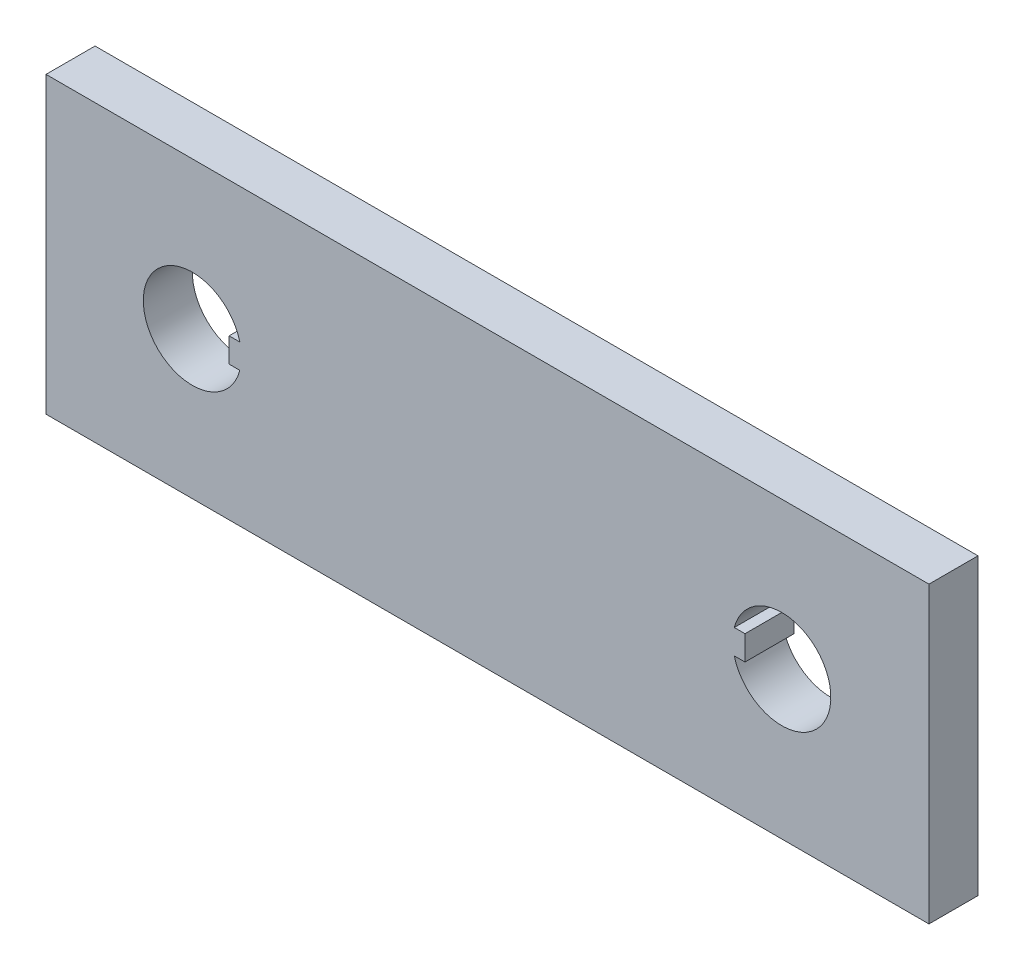
ISO-10303-21;
HEADER;
FILE_DESCRIPTION(('STEP AP214'),'2;1');
FILE_NAME('part.step','',(''),(''),'','','');
FILE_SCHEMA(('AUTOMOTIVE_DESIGN { 1 0 10303 214 1 1 1 1 }'));
ENDSEC;
DATA;
#1=APPLICATION_CONTEXT('core data for automotive mechanical design processes');
#2=APPLICATION_PROTOCOL_DEFINITION('international standard','automotive_design',2000,#1);
#3=PRODUCT_CONTEXT('',#1,'mechanical');
#4=PRODUCT('Part','Part','',(#3));
#5=PRODUCT_RELATED_PRODUCT_CATEGORY('part','',(#4));
#6=PRODUCT_DEFINITION_FORMATION('','',#4);
#7=PRODUCT_DEFINITION_CONTEXT('part definition',#1,'design');
#8=PRODUCT_DEFINITION('design','',#6,#7);
#9=PRODUCT_DEFINITION_SHAPE('','',#8);
#10=(LENGTH_UNIT() NAMED_UNIT(*) SI_UNIT(.MILLI.,.METRE.));
#11=(NAMED_UNIT(*) PLANE_ANGLE_UNIT() SI_UNIT($,.RADIAN.));
#12=(NAMED_UNIT(*) SI_UNIT($,.STERADIAN.) SOLID_ANGLE_UNIT());
#13=UNCERTAINTY_MEASURE_WITH_UNIT(LENGTH_MEASURE(1.E-05),#10,'distance_accuracy_value','');
#14=(GEOMETRIC_REPRESENTATION_CONTEXT(3) GLOBAL_UNCERTAINTY_ASSIGNED_CONTEXT((#13)) GLOBAL_UNIT_ASSIGNED_CONTEXT((#10,
#11,#12)) REPRESENTATION_CONTEXT('',''));
#15=CARTESIAN_POINT('',(0.,0.,0.));
#16=DIRECTION('',(0.,0.,1.));
#17=DIRECTION('',(1.,0.,0.));
#18=AXIS2_PLACEMENT_3D('',#15,#16,#17);
#19=CARTESIAN_POINT('',(57.15,-19.05,6.35));
#20=DIRECTION('',(-1.,0.,0.));
#21=DIRECTION('',(0.,0.,1.));
#22=AXIS2_PLACEMENT_3D('',#19,#20,#21);
#23=PLANE('',#22);
#24=DIRECTION('',(0.,1.,0.));
#25=VECTOR('',#24,1.);
#26=CARTESIAN_POINT('',(57.15,-19.05,0.));
#27=LINE('',#26,#25);
#28=CARTESIAN_POINT('',(57.15,-19.05,0.));
#29=VERTEX_POINT('',#28);
#30=CARTESIAN_POINT('',(57.15,19.05,0.));
#31=VERTEX_POINT('',#30);
#32=EDGE_CURVE('E183',#29,#31,#27,.T.);
#33=ORIENTED_EDGE('',*,*,#32,.T.);
#34=DIRECTION('',(0.,0.,-1.));
#35=VECTOR('',#34,1.);
#36=CARTESIAN_POINT('',(57.15,19.05,6.35));
#37=LINE('',#36,#35);
#38=CARTESIAN_POINT('',(57.15,19.05,6.35));
#39=VERTEX_POINT('',#38);
#40=EDGE_CURVE('E11',#39,#31,#37,.T.);
#41=ORIENTED_EDGE('',*,*,#40,.F.);
#42=DIRECTION('',(0.,1.,0.));
#43=VECTOR('',#42,1.);
#44=CARTESIAN_POINT('',(57.15,-19.05,6.35));
#45=LINE('',#44,#43);
#46=CARTESIAN_POINT('',(57.15,-19.05,6.35));
#47=VERTEX_POINT('',#46);
#48=EDGE_CURVE('E190',#47,#39,#45,.T.);
#49=ORIENTED_EDGE('',*,*,#48,.F.);
#50=DIRECTION('',(0.,0.,-1.));
#51=VECTOR('',#50,1.);
#52=CARTESIAN_POINT('',(57.15,-19.05,6.35));
#53=LINE('',#52,#51);
#54=EDGE_CURVE('E200',#47,#29,#53,.T.);
#55=ORIENTED_EDGE('',*,*,#54,.T.);
#56=EDGE_LOOP('',(#33,#41,#49,#55));
#57=FACE_BOUND('',#56,.T.);
#58=ADVANCED_FACE('F33',(#57),#23,.F.);
#59=CARTESIAN_POINT('',(-57.15,19.05,6.35));
#60=DIRECTION('',(0.,-1.,0.));
#61=DIRECTION('',(0.,0.,-1.));
#62=AXIS2_PLACEMENT_3D('',#59,#60,#61);
#63=PLANE('',#62);
#64=DIRECTION('',(-1.,0.,0.));
#65=VECTOR('',#64,1.);
#66=CARTESIAN_POINT('',(-57.15,19.05,0.));
#67=LINE('',#66,#65);
#68=CARTESIAN_POINT('',(-57.15,19.05,0.));
#69=VERTEX_POINT('',#68);
#70=EDGE_CURVE('E203',#31,#69,#67,.T.);
#71=ORIENTED_EDGE('',*,*,#70,.T.);
#72=DIRECTION('',(0.,0.,-1.));
#73=VECTOR('',#72,1.);
#74=CARTESIAN_POINT('',(-57.15,19.05,6.35));
#75=LINE('',#74,#73);
#76=CARTESIAN_POINT('',(-57.15,19.05,6.35));
#77=VERTEX_POINT('',#76);
#78=EDGE_CURVE('E40',#77,#69,#75,.T.);
#79=ORIENTED_EDGE('',*,*,#78,.F.);
#80=DIRECTION('',(-1.,0.,0.));
#81=VECTOR('',#80,1.);
#82=CARTESIAN_POINT('',(-57.15,19.05,6.35));
#83=LINE('',#82,#81);
#84=EDGE_CURVE('E193',#39,#77,#83,.T.);
#85=ORIENTED_EDGE('',*,*,#84,.F.);
#86=ORIENTED_EDGE('',*,*,#40,.T.);
#87=EDGE_LOOP('',(#71,#79,#85,#86));
#88=FACE_BOUND('',#87,.T.);
#89=ADVANCED_FACE('F232',(#88),#63,.F.);
#90=CARTESIAN_POINT('',(-57.15,-19.05,6.35));
#91=DIRECTION('',(1.,0.,0.));
#92=DIRECTION('',(0.,0.,-1.));
#93=AXIS2_PLACEMENT_3D('',#90,#91,#92);
#94=PLANE('',#93);
#95=DIRECTION('',(0.,-1.,0.));
#96=VECTOR('',#95,1.);
#97=CARTESIAN_POINT('',(-57.15,-19.05,0.));
#98=LINE('',#97,#96);
#99=CARTESIAN_POINT('',(-57.15,-19.05,0.));
#100=VERTEX_POINT('',#99);
#101=EDGE_CURVE('E205',#69,#100,#98,.T.);
#102=ORIENTED_EDGE('',*,*,#101,.T.);
#103=DIRECTION('',(0.,0.,-1.));
#104=VECTOR('',#103,1.);
#105=CARTESIAN_POINT('',(-57.15,-19.05,6.35));
#106=LINE('',#105,#104);
#107=CARTESIAN_POINT('',(-57.15,-19.05,6.35));
#108=VERTEX_POINT('',#107);
#109=EDGE_CURVE('E210',#108,#100,#106,.T.);
#110=ORIENTED_EDGE('',*,*,#109,.F.);
#111=DIRECTION('',(0.,-1.,0.));
#112=VECTOR('',#111,1.);
#113=CARTESIAN_POINT('',(-57.15,-19.05,6.35));
#114=LINE('',#113,#112);
#115=EDGE_CURVE('E196',#77,#108,#114,.T.);
#116=ORIENTED_EDGE('',*,*,#115,.F.);
#117=ORIENTED_EDGE('',*,*,#78,.T.);
#118=EDGE_LOOP('',(#102,#110,#116,#117));
#119=FACE_BOUND('',#118,.T.);
#120=ADVANCED_FACE('F217',(#119),#94,.F.);
#121=CARTESIAN_POINT('',(-57.15,-19.05,6.35));
#122=DIRECTION('',(0.,1.,0.));
#123=DIRECTION('',(0.,0.,1.));
#124=AXIS2_PLACEMENT_3D('',#121,#122,#123);
#125=PLANE('',#124);
#126=DIRECTION('',(1.,0.,0.));
#127=VECTOR('',#126,1.);
#128=CARTESIAN_POINT('',(-57.15,-19.05,0.));
#129=LINE('',#128,#127);
#130=EDGE_CURVE('E194',#100,#29,#129,.T.);
#131=ORIENTED_EDGE('',*,*,#130,.T.);
#132=ORIENTED_EDGE('',*,*,#54,.F.);
#133=DIRECTION('',(1.,0.,0.));
#134=VECTOR('',#133,1.);
#135=CARTESIAN_POINT('',(-57.15,-19.05,6.35));
#136=LINE('',#135,#134);
#137=EDGE_CURVE('E198',#108,#47,#136,.T.);
#138=ORIENTED_EDGE('',*,*,#137,.F.);
#139=ORIENTED_EDGE('',*,*,#109,.T.);
#140=EDGE_LOOP('',(#131,#132,#138,#139));
#141=FACE_BOUND('',#140,.T.);
#142=ADVANCED_FACE('F225',(#141),#125,.F.);
#143=CARTESIAN_POINT('',(0.,0.,6.35));
#144=DIRECTION('',(0.,0.,-1.));
#145=DIRECTION('',(-1.,0.,0.));
#146=AXIS2_PLACEMENT_3D('',#143,#144,#145);
#147=PLANE('',#146);
#148=DIRECTION('',(0.,1.,0.));
#149=VECTOR('',#148,1.);
#150=CARTESIAN_POINT('',(-33.4428218738634,1.58870753969171,6.35));
#151=LINE('',#150,#149);
#152=CARTESIAN_POINT('',(-33.4428218738634,-1.58629246030829,6.35));
#153=VERTEX_POINT('',#152);
#154=CARTESIAN_POINT('',(-33.4428218738634,1.58870753969171,6.35));
#155=VERTEX_POINT('',#154);
#156=EDGE_CURVE('E148',#153,#155,#151,.T.);
#157=ORIENTED_EDGE('',*,*,#156,.F.);
#158=DIRECTION('',(-1.,0.,0.));
#159=VECTOR('',#158,1.);
#160=CARTESIAN_POINT('',(-32.0566491528309,-1.58629246030828,6.35));
#161=LINE('',#160,#159);
#162=CARTESIAN_POINT('',(-32.0566491528309,-1.58629246030828,6.35));
#163=VERTEX_POINT('',#162);
#164=EDGE_CURVE('E47',#163,#153,#161,.T.);
#165=ORIENTED_EDGE('',*,*,#164,.F.);
#166=CARTESIAN_POINT('',(-38.2053218738634,0.,6.35));
#167=DIRECTION('',(0.,0.,1.));
#168=DIRECTION('',(1.,0.,0.));
#169=AXIS2_PLACEMENT_3D('',#166,#167,#168);
#170=CIRCLE('',#169,6.35);
#171=CARTESIAN_POINT('',(-32.0572727236592,1.58870753969172,6.35));
#172=VERTEX_POINT('',#171);
#173=EDGE_CURVE('E139',#172,#163,#170,.T.);
#174=ORIENTED_EDGE('',*,*,#173,.F.);
#175=DIRECTION('',(1.,0.,0.));
#176=VECTOR('',#175,1.);
#177=CARTESIAN_POINT('',(-32.0572727236592,1.58870753969172,6.35));
#178=LINE('',#177,#176);
#179=EDGE_CURVE('E142',#155,#172,#178,.T.);
#180=ORIENTED_EDGE('',*,*,#179,.F.);
#181=EDGE_LOOP('',(#157,#165,#174,#180));
#182=FACE_BOUND('',#181,.T.);
#183=DIRECTION('',(0.,-1.,0.));
#184=VECTOR('',#183,1.);
#185=CARTESIAN_POINT('',(33.3375,-1.58870753969167,6.35));
#186=LINE('',#185,#184);
#187=CARTESIAN_POINT('',(33.3375,1.58629246030833,6.35));
#188=VERTEX_POINT('',#187);
#189=CARTESIAN_POINT('',(33.3375,-1.58870753969167,6.35));
#190=VERTEX_POINT('',#189);
#191=EDGE_CURVE('E173',#188,#190,#186,.T.);
#192=ORIENTED_EDGE('',*,*,#191,.F.);
#193=DIRECTION('',(1.,0.,0.));
#194=VECTOR('',#193,1.);
#195=CARTESIAN_POINT('',(31.9513272789675,1.58629246030833,6.35));
#196=LINE('',#195,#194);
#197=CARTESIAN_POINT('',(31.9513272789675,1.58629246030833,6.35));
#198=VERTEX_POINT('',#197);
#199=EDGE_CURVE('E154',#198,#188,#196,.T.);
#200=ORIENTED_EDGE('',*,*,#199,.F.);
#201=CARTESIAN_POINT('',(38.1,0.,6.35));
#202=DIRECTION('',(0.,0.,1.));
#203=DIRECTION('',(1.,0.,0.));
#204=AXIS2_PLACEMENT_3D('',#201,#202,#203);
#205=CIRCLE('',#204,6.35);
#206=CARTESIAN_POINT('',(31.9519508497958,-1.58870753969167,6.35));
#207=VERTEX_POINT('',#206);
#208=EDGE_CURVE('E162',#207,#198,#205,.T.);
#209=ORIENTED_EDGE('',*,*,#208,.F.);
#210=DIRECTION('',(-1.,0.,0.));
#211=VECTOR('',#210,1.);
#212=CARTESIAN_POINT('',(31.9519508497958,-1.58870753969167,6.35));
#213=LINE('',#212,#211);
#214=EDGE_CURVE('E176',#190,#207,#213,.T.);
#215=ORIENTED_EDGE('',*,*,#214,.F.);
#216=EDGE_LOOP('',(#192,#200,#209,#215));
#217=FACE_BOUND('',#216,.T.);
#218=ORIENTED_EDGE('',*,*,#48,.T.);
#219=ORIENTED_EDGE('',*,*,#84,.T.);
#220=ORIENTED_EDGE('',*,*,#115,.T.);
#221=ORIENTED_EDGE('',*,*,#137,.T.);
#222=EDGE_LOOP('',(#218,#219,#220,#221));
#223=FACE_BOUND('',#222,.T.);
#224=ADVANCED_FACE('F231',(#182,#217,#223),#147,.F.);
#225=CARTESIAN_POINT('',(0.,0.,0.));
#226=DIRECTION('',(0.,0.,-1.));
#227=DIRECTION('',(-1.,0.,0.));
#228=AXIS2_PLACEMENT_3D('',#225,#226,#227);
#229=PLANE('',#228);
#230=DIRECTION('',(-1.,0.,0.));
#231=VECTOR('',#230,1.);
#232=CARTESIAN_POINT('',(-32.0566491528309,-1.58629246030828,0.));
#233=LINE('',#232,#231);
#234=CARTESIAN_POINT('',(-32.0566491528309,-1.58629246030828,0.));
#235=VERTEX_POINT('',#234);
#236=CARTESIAN_POINT('',(-33.4428218738634,-1.58629246030829,0.));
#237=VERTEX_POINT('',#236);
#238=EDGE_CURVE('E123',#235,#237,#233,.T.);
#239=ORIENTED_EDGE('',*,*,#238,.T.);
#240=DIRECTION('',(0.,1.,0.));
#241=VECTOR('',#240,1.);
#242=CARTESIAN_POINT('',(-33.4428218738634,1.58870753969171,0.));
#243=LINE('',#242,#241);
#244=CARTESIAN_POINT('',(-33.4428218738634,1.58870753969171,0.));
#245=VERTEX_POINT('',#244);
#246=EDGE_CURVE('E132',#237,#245,#243,.T.);
#247=ORIENTED_EDGE('',*,*,#246,.T.);
#248=DIRECTION('',(1.,0.,0.));
#249=VECTOR('',#248,1.);
#250=CARTESIAN_POINT('',(-32.0572727236592,1.58870753969172,0.));
#251=LINE('',#250,#249);
#252=CARTESIAN_POINT('',(-32.0572727236592,1.58870753969172,0.));
#253=VERTEX_POINT('',#252);
#254=EDGE_CURVE('E55',#245,#253,#251,.T.);
#255=ORIENTED_EDGE('',*,*,#254,.T.);
#256=CARTESIAN_POINT('',(-38.2053218738634,0.,0.));
#257=DIRECTION('',(0.,0.,1.));
#258=DIRECTION('',(1.,0.,0.));
#259=AXIS2_PLACEMENT_3D('',#256,#257,#258);
#260=CIRCLE('',#259,6.35);
#261=EDGE_CURVE('E129',#253,#235,#260,.T.);
#262=ORIENTED_EDGE('',*,*,#261,.T.);
#263=EDGE_LOOP('',(#239,#247,#255,#262));
#264=FACE_BOUND('',#263,.T.);
#265=DIRECTION('',(1.,0.,0.));
#266=VECTOR('',#265,1.);
#267=CARTESIAN_POINT('',(31.9513272789675,1.58629246030833,0.));
#268=LINE('',#267,#266);
#269=CARTESIAN_POINT('',(31.9513272789675,1.58629246030833,0.));
#270=VERTEX_POINT('',#269);
#271=CARTESIAN_POINT('',(33.3375,1.58629246030833,0.));
#272=VERTEX_POINT('',#271);
#273=EDGE_CURVE('E158',#270,#272,#268,.T.);
#274=ORIENTED_EDGE('',*,*,#273,.T.);
#275=DIRECTION('',(0.,-1.,0.));
#276=VECTOR('',#275,1.);
#277=CARTESIAN_POINT('',(33.3375,-1.58870753969167,0.));
#278=LINE('',#277,#276);
#279=CARTESIAN_POINT('',(33.3375,-1.58870753969167,0.));
#280=VERTEX_POINT('',#279);
#281=EDGE_CURVE('E161',#272,#280,#278,.T.);
#282=ORIENTED_EDGE('',*,*,#281,.T.);
#283=DIRECTION('',(-1.,0.,0.));
#284=VECTOR('',#283,1.);
#285=CARTESIAN_POINT('',(31.9519508497958,-1.58870753969167,0.));
#286=LINE('',#285,#284);
#287=CARTESIAN_POINT('',(31.9519508497958,-1.58870753969167,0.));
#288=VERTEX_POINT('',#287);
#289=EDGE_CURVE('E165',#280,#288,#286,.T.);
#290=ORIENTED_EDGE('',*,*,#289,.T.);
#291=CARTESIAN_POINT('',(38.1,0.,0.));
#292=DIRECTION('',(0.,0.,1.));
#293=DIRECTION('',(1.,0.,0.));
#294=AXIS2_PLACEMENT_3D('',#291,#292,#293);
#295=CIRCLE('',#294,6.35);
#296=EDGE_CURVE('E168',#288,#270,#295,.T.);
#297=ORIENTED_EDGE('',*,*,#296,.T.);
#298=EDGE_LOOP('',(#274,#282,#290,#297));
#299=FACE_BOUND('',#298,.T.);
#300=ORIENTED_EDGE('',*,*,#32,.F.);
#301=ORIENTED_EDGE('',*,*,#130,.F.);
#302=ORIENTED_EDGE('',*,*,#101,.F.);
#303=ORIENTED_EDGE('',*,*,#70,.F.);
#304=EDGE_LOOP('',(#300,#301,#302,#303));
#305=FACE_BOUND('',#304,.T.);
#306=ADVANCED_FACE('F136',(#264,#299,#305),#229,.T.);
#307=CARTESIAN_POINT('',(31.9513272789675,1.58629246030833,0.));
#308=DIRECTION('',(0.,-1.,0.));
#309=DIRECTION('',(1.,0.,0.));
#310=AXIS2_PLACEMENT_3D('',#307,#308,#309);
#311=PLANE('',#310);
#312=ORIENTED_EDGE('',*,*,#199,.T.);
#313=DIRECTION('',(0.,0.,1.));
#314=VECTOR('',#313,1.);
#315=CARTESIAN_POINT('',(33.3375,1.58629246030833,0.));
#316=LINE('',#315,#314);
#317=EDGE_CURVE('E171',#272,#188,#316,.T.);
#318=ORIENTED_EDGE('',*,*,#317,.F.);
#319=ORIENTED_EDGE('',*,*,#273,.F.);
#320=DIRECTION('',(0.,0.,1.));
#321=VECTOR('',#320,1.);
#322=CARTESIAN_POINT('',(31.9513272789675,1.58629246030833,0.));
#323=LINE('',#322,#321);
#324=EDGE_CURVE('E181',#270,#198,#323,.T.);
#325=ORIENTED_EDGE('',*,*,#324,.T.);
#326=EDGE_LOOP('',(#312,#318,#319,#325));
#327=FACE_BOUND('',#326,.T.);
#328=ADVANCED_FACE('F244',(#327),#311,.F.);
#329=CARTESIAN_POINT('',(38.1,0.,0.));
#330=DIRECTION('',(0.,0.,1.));
#331=DIRECTION('',(1.,0.,0.));
#332=AXIS2_PLACEMENT_3D('',#329,#330,#331);
#333=CYLINDRICAL_SURFACE('',#332,6.35);
#334=ORIENTED_EDGE('',*,*,#208,.T.);
#335=ORIENTED_EDGE('',*,*,#324,.F.);
#336=ORIENTED_EDGE('',*,*,#296,.F.);
#337=DIRECTION('',(0.,0.,1.));
#338=VECTOR('',#337,1.);
#339=CARTESIAN_POINT('',(31.9519508497958,-1.58870753969167,0.));
#340=LINE('',#339,#338);
#341=EDGE_CURVE('E184',#288,#207,#340,.T.);
#342=ORIENTED_EDGE('',*,*,#341,.T.);
#343=EDGE_LOOP('',(#334,#335,#336,#342));
#344=FACE_BOUND('',#343,.T.);
#345=ADVANCED_FACE('F250',(#344),#333,.F.);
#346=CARTESIAN_POINT('',(31.9519508497958,-1.58870753969167,0.));
#347=DIRECTION('',(0.,1.,0.));
#348=DIRECTION('',(-1.,0.,0.));
#349=AXIS2_PLACEMENT_3D('',#346,#347,#348);
#350=PLANE('',#349);
#351=ORIENTED_EDGE('',*,*,#214,.T.);
#352=ORIENTED_EDGE('',*,*,#341,.F.);
#353=ORIENTED_EDGE('',*,*,#289,.F.);
#354=DIRECTION('',(0.,0.,1.));
#355=VECTOR('',#354,1.);
#356=CARTESIAN_POINT('',(33.3375,-1.58870753969167,0.));
#357=LINE('',#356,#355);
#358=EDGE_CURVE('E186',#280,#190,#357,.T.);
#359=ORIENTED_EDGE('',*,*,#358,.T.);
#360=EDGE_LOOP('',(#351,#352,#353,#359));
#361=FACE_BOUND('',#360,.T.);
#362=ADVANCED_FACE('F255',(#361),#350,.F.);
#363=CARTESIAN_POINT('',(33.3375,-1.58870753969167,0.));
#364=DIRECTION('',(-1.,0.,0.));
#365=DIRECTION('',(0.,-1.,0.));
#366=AXIS2_PLACEMENT_3D('',#363,#364,#365);
#367=PLANE('',#366);
#368=ORIENTED_EDGE('',*,*,#191,.T.);
#369=ORIENTED_EDGE('',*,*,#358,.F.);
#370=ORIENTED_EDGE('',*,*,#281,.F.);
#371=ORIENTED_EDGE('',*,*,#317,.T.);
#372=EDGE_LOOP('',(#368,#369,#370,#371));
#373=FACE_BOUND('',#372,.T.);
#374=ADVANCED_FACE('F252',(#373),#367,.F.);
#375=CARTESIAN_POINT('',(-32.0566491528309,-1.58629246030828,0.));
#376=DIRECTION('',(0.,1.,0.));
#377=DIRECTION('',(-1.,0.,0.));
#378=AXIS2_PLACEMENT_3D('',#375,#376,#377);
#379=PLANE('',#378);
#380=ORIENTED_EDGE('',*,*,#164,.T.);
#381=DIRECTION('',(0.,0.,1.));
#382=VECTOR('',#381,1.);
#383=CARTESIAN_POINT('',(-33.4428218738634,-1.58629246030829,0.));
#384=LINE('',#383,#382);
#385=EDGE_CURVE('E119',#237,#153,#384,.T.);
#386=ORIENTED_EDGE('',*,*,#385,.F.);
#387=ORIENTED_EDGE('',*,*,#238,.F.);
#388=DIRECTION('',(0.,0.,1.));
#389=VECTOR('',#388,1.);
#390=CARTESIAN_POINT('',(-32.0566491528309,-1.58629246030828,0.));
#391=LINE('',#390,#389);
#392=EDGE_CURVE('E152',#235,#163,#391,.T.);
#393=ORIENTED_EDGE('',*,*,#392,.T.);
#394=EDGE_LOOP('',(#380,#386,#387,#393));
#395=FACE_BOUND('',#394,.T.);
#396=ADVANCED_FACE('F121',(#395),#379,.F.);
#397=CARTESIAN_POINT('',(-38.2053218738634,0.,0.));
#398=DIRECTION('',(0.,0.,1.));
#399=DIRECTION('',(1.,0.,0.));
#400=AXIS2_PLACEMENT_3D('',#397,#398,#399);
#401=CYLINDRICAL_SURFACE('',#400,6.35);
#402=ORIENTED_EDGE('',*,*,#173,.T.);
#403=ORIENTED_EDGE('',*,*,#392,.F.);
#404=ORIENTED_EDGE('',*,*,#261,.F.);
#405=DIRECTION('',(0.,0.,1.));
#406=VECTOR('',#405,1.);
#407=CARTESIAN_POINT('',(-32.0572727236592,1.58870753969172,0.));
#408=LINE('',#407,#406);
#409=EDGE_CURVE('E155',#253,#172,#408,.T.);
#410=ORIENTED_EDGE('',*,*,#409,.T.);
#411=EDGE_LOOP('',(#402,#403,#404,#410));
#412=FACE_BOUND('',#411,.T.);
#413=ADVANCED_FACE('F265',(#412),#401,.F.);
#414=CARTESIAN_POINT('',(-32.0572727236592,1.58870753969172,0.));
#415=DIRECTION('',(0.,-1.,0.));
#416=DIRECTION('',(1.,0.,0.));
#417=AXIS2_PLACEMENT_3D('',#414,#415,#416);
#418=PLANE('',#417);
#419=ORIENTED_EDGE('',*,*,#179,.T.);
#420=ORIENTED_EDGE('',*,*,#409,.F.);
#421=ORIENTED_EDGE('',*,*,#254,.F.);
#422=DIRECTION('',(0.,0.,1.));
#423=VECTOR('',#422,1.);
#424=CARTESIAN_POINT('',(-33.4428218738634,1.58870753969171,0.));
#425=LINE('',#424,#423);
#426=EDGE_CURVE('E128',#245,#155,#425,.T.);
#427=ORIENTED_EDGE('',*,*,#426,.T.);
#428=EDGE_LOOP('',(#419,#420,#421,#427));
#429=FACE_BOUND('',#428,.T.);
#430=ADVANCED_FACE('F268',(#429),#418,.F.);
#431=CARTESIAN_POINT('',(-33.4428218738634,1.58870753969171,0.));
#432=DIRECTION('',(1.,0.,0.));
#433=DIRECTION('',(0.,1.,0.));
#434=AXIS2_PLACEMENT_3D('',#431,#432,#433);
#435=PLANE('',#434);
#436=ORIENTED_EDGE('',*,*,#156,.T.);
#437=ORIENTED_EDGE('',*,*,#426,.F.);
#438=ORIENTED_EDGE('',*,*,#246,.F.);
#439=ORIENTED_EDGE('',*,*,#385,.T.);
#440=EDGE_LOOP('',(#436,#437,#438,#439));
#441=FACE_BOUND('',#440,.T.);
#442=ADVANCED_FACE('F133',(#441),#435,.F.);
#443=CLOSED_SHELL('',(#58,#89,#120,#142,#224,#306,#328,#345,#362,#374,#396,#413,#430,#442));
#444=MANIFOLD_SOLID_BREP('B2',#443);
#445=ADVANCED_BREP_SHAPE_REPRESENTATION('',(#18,#444),#14);
#446=SHAPE_DEFINITION_REPRESENTATION(#9,#445);
ENDSEC;
END-ISO-10303-21;
